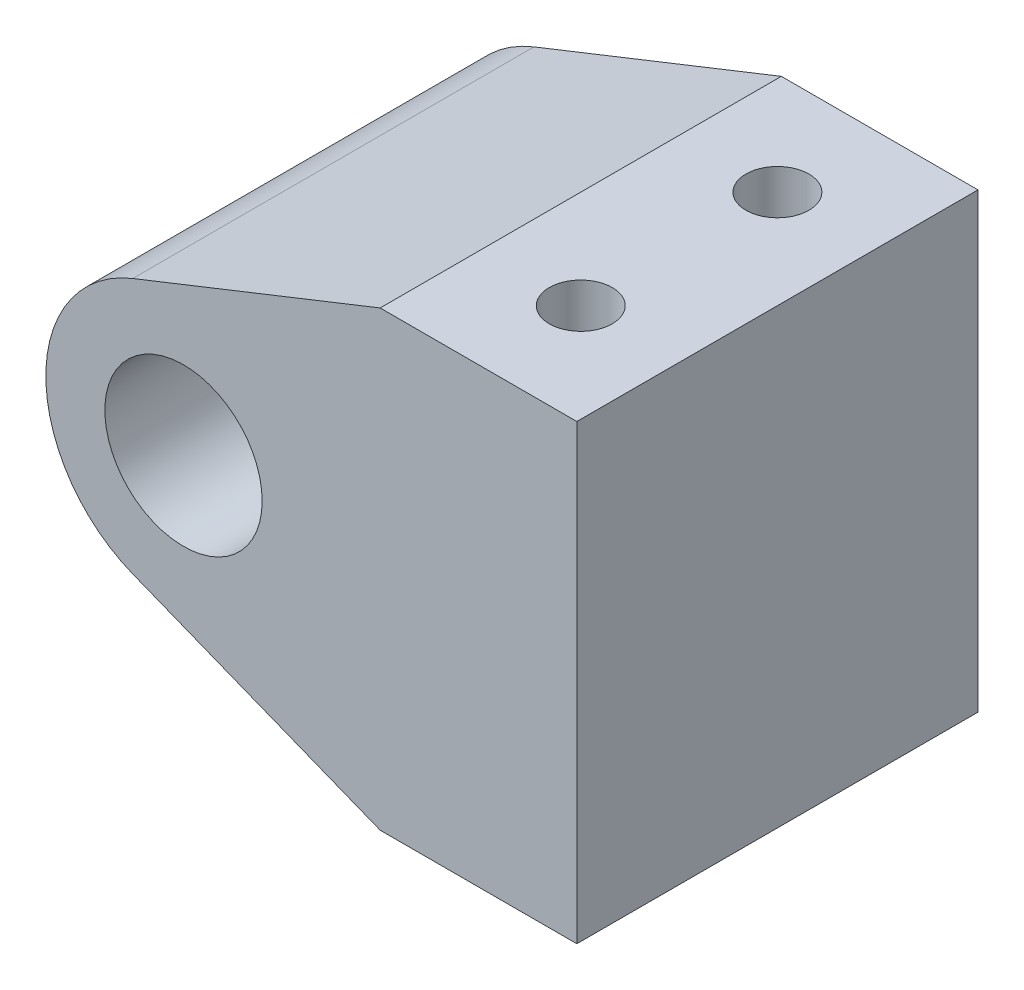
ISO-10303-21;
HEADER;
FILE_DESCRIPTION(('STEP AP214'),'2;1');
FILE_NAME('part.step','',(''),(''),'','','');
FILE_SCHEMA(('AUTOMOTIVE_DESIGN { 1 0 10303 214 1 1 1 1 }'));
ENDSEC;
DATA;
#1=APPLICATION_CONTEXT('core data for automotive mechanical design processes');
#2=APPLICATION_PROTOCOL_DEFINITION('international standard','automotive_design',2000,#1);
#3=PRODUCT_CONTEXT('',#1,'mechanical');
#4=PRODUCT('Part','Part','',(#3));
#5=PRODUCT_RELATED_PRODUCT_CATEGORY('part','',(#4));
#6=PRODUCT_DEFINITION_FORMATION('','',#4);
#7=PRODUCT_DEFINITION_CONTEXT('part definition',#1,'design');
#8=PRODUCT_DEFINITION('design','',#6,#7);
#9=PRODUCT_DEFINITION_SHAPE('','',#8);
#10=(LENGTH_UNIT() NAMED_UNIT(*) SI_UNIT(.MILLI.,.METRE.));
#11=(NAMED_UNIT(*) PLANE_ANGLE_UNIT() SI_UNIT($,.RADIAN.));
#12=(NAMED_UNIT(*) SI_UNIT($,.STERADIAN.) SOLID_ANGLE_UNIT());
#13=UNCERTAINTY_MEASURE_WITH_UNIT(LENGTH_MEASURE(1.E-05),#10,'distance_accuracy_value','');
#14=(GEOMETRIC_REPRESENTATION_CONTEXT(3) GLOBAL_UNCERTAINTY_ASSIGNED_CONTEXT((#13)) GLOBAL_UNIT_ASSIGNED_CONTEXT((#10,
#11,#12)) REPRESENTATION_CONTEXT('',''));
#15=CARTESIAN_POINT('',(0.,0.,0.));
#16=DIRECTION('',(0.,0.,1.));
#17=DIRECTION('',(1.,0.,0.));
#18=AXIS2_PLACEMENT_3D('',#15,#16,#17);
#19=CARTESIAN_POINT('',(-20.,11.5,-20.4));
#20=DIRECTION('',(0.,0.,-1.));
#21=DIRECTION('',(1.,0.,0.));
#22=AXIS2_PLACEMENT_3D('',#19,#20,#21);
#23=PLANE('',#22);
#24=DIRECTION('',(0.,1.,0.));
#25=VECTOR('',#24,1.);
#26=CARTESIAN_POINT('',(0.,0.,-20.4));
#27=LINE('',#26,#25);
#28=CARTESIAN_POINT('',(0.,0.,-20.4));
#29=VERTEX_POINT('',#28);
#30=CARTESIAN_POINT('',(0.,23.,-20.4));
#31=VERTEX_POINT('',#30);
#32=EDGE_CURVE('E143',#29,#31,#27,.T.);
#33=ORIENTED_EDGE('',*,*,#32,.F.);
#34=DIRECTION('',(1.,0.,0.));
#35=VECTOR('',#34,1.);
#36=CARTESIAN_POINT('',(0.,0.,-20.4));
#37=LINE('',#36,#35);
#38=CARTESIAN_POINT('',(-10.,0.,-20.4));
#39=VERTEX_POINT('',#38);
#40=EDGE_CURVE('E123',#39,#29,#37,.T.);
#41=ORIENTED_EDGE('',*,*,#40,.F.);
#42=DIRECTION('',(0.929471964291965,-0.36889275893576,0.));
#43=VECTOR('',#42,1.);
#44=CARTESIAN_POINT('',(-22.5822493125503,4.99369624995625,-20.4));
#45=LINE('',#44,#43);
#46=CARTESIAN_POINT('',(-22.5822493125503,4.99369624995625,-20.4));
#47=VERTEX_POINT('',#46);
#48=EDGE_CURVE('E104',#47,#39,#45,.T.);
#49=ORIENTED_EDGE('',*,*,#48,.F.);
#50=CARTESIAN_POINT('',(-20.,11.5,-20.4));
#51=DIRECTION('',(0.,0.,1.));
#52=DIRECTION('',(1.,0.,0.));
#53=AXIS2_PLACEMENT_3D('',#50,#51,#52);
#54=CIRCLE('',#53,7.);
#55=CARTESIAN_POINT('',(-22.5822493125503,18.0063037500437,-20.4));
#56=VERTEX_POINT('',#55);
#57=EDGE_CURVE('E114',#56,#47,#54,.T.);
#58=ORIENTED_EDGE('',*,*,#57,.F.);
#59=DIRECTION('',(-0.929471964291965,-0.36889275893576,0.));
#60=VECTOR('',#59,1.);
#61=CARTESIAN_POINT('',(-22.5822493125503,18.0063037500437,-20.4));
#62=LINE('',#61,#60);
#63=CARTESIAN_POINT('',(-10.,23.,-20.4));
#64=VERTEX_POINT('',#63);
#65=EDGE_CURVE('E119',#64,#56,#62,.T.);
#66=ORIENTED_EDGE('',*,*,#65,.F.);
#67=DIRECTION('',(-1.,0.,0.));
#68=VECTOR('',#67,1.);
#69=CARTESIAN_POINT('',(0.,23.,-20.4));
#70=LINE('',#69,#68);
#71=EDGE_CURVE('E148',#31,#64,#70,.T.);
#72=ORIENTED_EDGE('',*,*,#71,.F.);
#73=EDGE_LOOP('',(#33,#41,#49,#58,#66,#72));
#74=FACE_BOUND('',#73,.T.);
#75=CARTESIAN_POINT('',(-20.,11.5,-20.4));
#76=DIRECTION('',(0.,0.,1.));
#77=DIRECTION('',(1.,0.,0.));
#78=AXIS2_PLACEMENT_3D('',#75,#76,#77);
#79=CIRCLE('',#78,4.);
#80=CARTESIAN_POINT('',(-16.,11.5,-20.4));
#81=VERTEX_POINT('',#80);
#82=EDGE_CURVE('E132',#81,#81,#79,.T.);
#83=ORIENTED_EDGE('',*,*,#82,.T.);
#84=EDGE_LOOP('',(#83));
#85=FACE_BOUND('',#84,.T.);
#86=ADVANCED_FACE('F43',(#74,#85),#23,.T.);
#87=CARTESIAN_POINT('',(-20.,11.5,0.));
#88=DIRECTION('',(0.,0.,-1.));
#89=DIRECTION('',(1.,0.,0.));
#90=AXIS2_PLACEMENT_3D('',#87,#88,#89);
#91=PLANE('',#90);
#92=DIRECTION('',(0.,1.,0.));
#93=VECTOR('',#92,1.);
#94=CARTESIAN_POINT('',(0.,0.,0.));
#95=LINE('',#94,#93);
#96=CARTESIAN_POINT('',(0.,0.,0.));
#97=VERTEX_POINT('',#96);
#98=CARTESIAN_POINT('',(0.,23.,0.));
#99=VERTEX_POINT('',#98);
#100=EDGE_CURVE('E128',#97,#99,#95,.T.);
#101=ORIENTED_EDGE('',*,*,#100,.T.);
#102=DIRECTION('',(-1.,0.,0.));
#103=VECTOR('',#102,1.);
#104=CARTESIAN_POINT('',(0.,23.,0.));
#105=LINE('',#104,#103);
#106=CARTESIAN_POINT('',(-10.,23.,0.));
#107=VERTEX_POINT('',#106);
#108=EDGE_CURVE('E131',#99,#107,#105,.T.);
#109=ORIENTED_EDGE('',*,*,#108,.T.);
#110=DIRECTION('',(-0.929471964291965,-0.36889275893576,0.));
#111=VECTOR('',#110,1.);
#112=CARTESIAN_POINT('',(-22.5822493125503,18.0063037500437,0.));
#113=LINE('',#112,#111);
#114=CARTESIAN_POINT('',(-22.5822493125503,18.0063037500437,0.));
#115=VERTEX_POINT('',#114);
#116=EDGE_CURVE('E135',#107,#115,#113,.T.);
#117=ORIENTED_EDGE('',*,*,#116,.T.);
#118=CARTESIAN_POINT('',(-20.,11.5,0.));
#119=DIRECTION('',(0.,0.,1.));
#120=DIRECTION('',(1.,0.,0.));
#121=AXIS2_PLACEMENT_3D('',#118,#119,#120);
#122=CIRCLE('',#121,7.);
#123=CARTESIAN_POINT('',(-22.5822493125503,4.99369624995625,0.));
#124=VERTEX_POINT('',#123);
#125=EDGE_CURVE('E138',#115,#124,#122,.T.);
#126=ORIENTED_EDGE('',*,*,#125,.T.);
#127=DIRECTION('',(0.929471964291965,-0.36889275893576,0.));
#128=VECTOR('',#127,1.);
#129=CARTESIAN_POINT('',(-22.5822493125503,4.99369624995625,0.));
#130=LINE('',#129,#128);
#131=CARTESIAN_POINT('',(-10.,0.,0.));
#132=VERTEX_POINT('',#131);
#133=EDGE_CURVE('E107',#124,#132,#130,.T.);
#134=ORIENTED_EDGE('',*,*,#133,.T.);
#135=DIRECTION('',(1.,0.,0.));
#136=VECTOR('',#135,1.);
#137=CARTESIAN_POINT('',(0.,0.,0.));
#138=LINE('',#137,#136);
#139=EDGE_CURVE('E141',#132,#97,#138,.T.);
#140=ORIENTED_EDGE('',*,*,#139,.T.);
#141=EDGE_LOOP('',(#101,#109,#117,#126,#134,#140));
#142=FACE_BOUND('',#141,.T.);
#143=CARTESIAN_POINT('',(-20.,11.5,0.));
#144=DIRECTION('',(0.,0.,1.));
#145=DIRECTION('',(1.,0.,0.));
#146=AXIS2_PLACEMENT_3D('',#143,#144,#145);
#147=CIRCLE('',#146,4.);
#148=CARTESIAN_POINT('',(-16.,11.5,0.));
#149=VERTEX_POINT('',#148);
#150=EDGE_CURVE('E157',#149,#149,#147,.T.);
#151=ORIENTED_EDGE('',*,*,#150,.F.);
#152=EDGE_LOOP('',(#151));
#153=FACE_BOUND('',#152,.T.);
#154=ADVANCED_FACE('F152',(#142,#153),#91,.F.);
#155=CARTESIAN_POINT('',(0.,0.,-20.4));
#156=DIRECTION('',(-1.,0.,0.));
#157=DIRECTION('',(0.,0.,-1.));
#158=AXIS2_PLACEMENT_3D('',#155,#156,#157);
#159=PLANE('',#158);
#160=ORIENTED_EDGE('',*,*,#100,.F.);
#161=DIRECTION('',(0.,0.,1.));
#162=VECTOR('',#161,1.);
#163=CARTESIAN_POINT('',(0.,0.,-20.4));
#164=LINE('',#163,#162);
#165=EDGE_CURVE('E60',#29,#97,#164,.T.);
#166=ORIENTED_EDGE('',*,*,#165,.F.);
#167=ORIENTED_EDGE('',*,*,#32,.T.);
#168=DIRECTION('',(0.,0.,1.));
#169=VECTOR('',#168,1.);
#170=CARTESIAN_POINT('',(0.,23.,-20.4));
#171=LINE('',#170,#169);
#172=EDGE_CURVE('E11',#31,#99,#171,.T.);
#173=ORIENTED_EDGE('',*,*,#172,.T.);
#174=EDGE_LOOP('',(#160,#166,#167,#173));
#175=FACE_BOUND('',#174,.T.);
#176=ADVANCED_FACE('F45',(#175),#159,.F.);
#177=CARTESIAN_POINT('',(0.,23.,-20.4));
#178=DIRECTION('',(0.,-1.,0.));
#179=DIRECTION('',(1.,0.,0.));
#180=AXIS2_PLACEMENT_3D('',#177,#178,#179);
#181=PLANE('',#180);
#182=CARTESIAN_POINT('',(-5.,23.,-5.2));
#183=DIRECTION('',(0.,-1.,0.));
#184=DIRECTION('',(-1.,0.,0.));
#185=AXIS2_PLACEMENT_3D('',#182,#183,#184);
#186=CIRCLE('',#185,1.6);
#187=CARTESIAN_POINT('',(-6.6,23.,-5.2));
#188=VERTEX_POINT('',#187);
#189=EDGE_CURVE('E169',#188,#188,#186,.T.);
#190=ORIENTED_EDGE('',*,*,#189,.T.);
#191=EDGE_LOOP('',(#190));
#192=FACE_BOUND('',#191,.T.);
#193=CARTESIAN_POINT('',(-5.,23.,-15.2));
#194=DIRECTION('',(0.,-1.,0.));
#195=DIRECTION('',(-1.,0.,0.));
#196=AXIS2_PLACEMENT_3D('',#193,#194,#195);
#197=CIRCLE('',#196,1.6);
#198=CARTESIAN_POINT('',(-6.6,23.,-15.2));
#199=VERTEX_POINT('',#198);
#200=EDGE_CURVE('E166',#199,#199,#197,.T.);
#201=ORIENTED_EDGE('',*,*,#200,.T.);
#202=EDGE_LOOP('',(#201));
#203=FACE_BOUND('',#202,.T.);
#204=ORIENTED_EDGE('',*,*,#108,.F.);
#205=ORIENTED_EDGE('',*,*,#172,.F.);
#206=ORIENTED_EDGE('',*,*,#71,.T.);
#207=DIRECTION('',(0.,0.,1.));
#208=VECTOR('',#207,1.);
#209=CARTESIAN_POINT('',(-10.,23.,-20.4));
#210=LINE('',#209,#208);
#211=EDGE_CURVE('E52',#64,#107,#210,.T.);
#212=ORIENTED_EDGE('',*,*,#211,.T.);
#213=EDGE_LOOP('',(#204,#205,#206,#212));
#214=FACE_BOUND('',#213,.T.);
#215=ADVANCED_FACE('F147',(#192,#203,#214),#181,.F.);
#216=CARTESIAN_POINT('',(-22.5822493125503,18.0063037500437,-20.4));
#217=DIRECTION('',(0.36889275893576,-0.929471964291965,0.));
#218=DIRECTION('',(0.929471964291965,0.36889275893576,0.));
#219=AXIS2_PLACEMENT_3D('',#216,#217,#218);
#220=PLANE('',#219);
#221=ORIENTED_EDGE('',*,*,#116,.F.);
#222=ORIENTED_EDGE('',*,*,#211,.F.);
#223=ORIENTED_EDGE('',*,*,#65,.T.);
#224=DIRECTION('',(0.,0.,1.));
#225=VECTOR('',#224,1.);
#226=CARTESIAN_POINT('',(-22.5822493125503,18.0063037500437,-20.4));
#227=LINE('',#226,#225);
#228=EDGE_CURVE('E111',#56,#115,#227,.T.);
#229=ORIENTED_EDGE('',*,*,#228,.T.);
#230=EDGE_LOOP('',(#221,#222,#223,#229));
#231=FACE_BOUND('',#230,.T.);
#232=ADVANCED_FACE('F150',(#231),#220,.F.);
#233=CARTESIAN_POINT('',(-20.,11.5,-20.4));
#234=DIRECTION('',(0.,0.,1.));
#235=DIRECTION('',(-1.,0.,0.));
#236=AXIS2_PLACEMENT_3D('',#233,#234,#235);
#237=CYLINDRICAL_SURFACE('',#236,7.);
#238=ORIENTED_EDGE('',*,*,#125,.F.);
#239=ORIENTED_EDGE('',*,*,#228,.F.);
#240=ORIENTED_EDGE('',*,*,#57,.T.);
#241=DIRECTION('',(0.,0.,1.));
#242=VECTOR('',#241,1.);
#243=CARTESIAN_POINT('',(-22.5822493125503,4.99369624995625,-20.4));
#244=LINE('',#243,#242);
#245=EDGE_CURVE('E100',#47,#124,#244,.T.);
#246=ORIENTED_EDGE('',*,*,#245,.T.);
#247=EDGE_LOOP('',(#238,#239,#240,#246));
#248=FACE_BOUND('',#247,.T.);
#249=ADVANCED_FACE('F115',(#248),#237,.T.);
#250=CARTESIAN_POINT('',(-22.5822493125503,4.99369624995625,-20.4));
#251=DIRECTION('',(0.36889275893576,0.929471964291965,0.));
#252=DIRECTION('',(-0.929471964291965,0.36889275893576,0.));
#253=AXIS2_PLACEMENT_3D('',#250,#251,#252);
#254=PLANE('',#253);
#255=ORIENTED_EDGE('',*,*,#133,.F.);
#256=ORIENTED_EDGE('',*,*,#245,.F.);
#257=ORIENTED_EDGE('',*,*,#48,.T.);
#258=DIRECTION('',(0.,0.,1.));
#259=VECTOR('',#258,1.);
#260=CARTESIAN_POINT('',(-10.,0.,-20.4));
#261=LINE('',#260,#259);
#262=EDGE_CURVE('E82',#39,#132,#261,.T.);
#263=ORIENTED_EDGE('',*,*,#262,.T.);
#264=EDGE_LOOP('',(#255,#256,#257,#263));
#265=FACE_BOUND('',#264,.T.);
#266=ADVANCED_FACE('F102',(#265),#254,.F.);
#267=CARTESIAN_POINT('',(0.,0.,-20.4));
#268=DIRECTION('',(0.,1.,0.));
#269=DIRECTION('',(-1.,0.,0.));
#270=AXIS2_PLACEMENT_3D('',#267,#268,#269);
#271=PLANE('',#270);
#272=CARTESIAN_POINT('',(-4.99999999999999,0.,-5.2));
#273=DIRECTION('',(0.,-1.,0.));
#274=DIRECTION('',(-1.,0.,0.));
#275=AXIS2_PLACEMENT_3D('',#272,#273,#274);
#276=CIRCLE('',#275,1.6);
#277=CARTESIAN_POINT('',(-6.59999999999999,0.,-5.2));
#278=VERTEX_POINT('',#277);
#279=EDGE_CURVE('E160',#278,#278,#276,.T.);
#280=ORIENTED_EDGE('',*,*,#279,.F.);
#281=EDGE_LOOP('',(#280));
#282=FACE_BOUND('',#281,.T.);
#283=CARTESIAN_POINT('',(-4.99999999999999,0.,-15.2));
#284=DIRECTION('',(0.,-1.,0.));
#285=DIRECTION('',(-1.,0.,0.));
#286=AXIS2_PLACEMENT_3D('',#283,#284,#285);
#287=CIRCLE('',#286,1.6);
#288=CARTESIAN_POINT('',(-6.59999999999999,0.,-15.2));
#289=VERTEX_POINT('',#288);
#290=EDGE_CURVE('E163',#289,#289,#287,.T.);
#291=ORIENTED_EDGE('',*,*,#290,.F.);
#292=EDGE_LOOP('',(#291));
#293=FACE_BOUND('',#292,.T.);
#294=ORIENTED_EDGE('',*,*,#139,.F.);
#295=ORIENTED_EDGE('',*,*,#262,.F.);
#296=ORIENTED_EDGE('',*,*,#40,.T.);
#297=ORIENTED_EDGE('',*,*,#165,.T.);
#298=EDGE_LOOP('',(#294,#295,#296,#297));
#299=FACE_BOUND('',#298,.T.);
#300=ADVANCED_FACE('F178',(#282,#293,#299),#271,.F.);
#301=CARTESIAN_POINT('',(-20.,11.5,-20.4));
#302=DIRECTION('',(0.,0.,1.));
#303=DIRECTION('',(-1.,0.,0.));
#304=AXIS2_PLACEMENT_3D('',#301,#302,#303);
#305=CYLINDRICAL_SURFACE('',#304,4.);
#306=ORIENTED_EDGE('',*,*,#82,.F.);
#307=EDGE_LOOP('',(#306));
#308=FACE_BOUND('',#307,.T.);
#309=ORIENTED_EDGE('',*,*,#150,.T.);
#310=EDGE_LOOP('',(#309));
#311=FACE_BOUND('',#310,.T.);
#312=ADVANCED_FACE('F181',(#308,#311),#305,.F.);
#313=CARTESIAN_POINT('',(-4.99999999999999,0.,-15.2));
#314=DIRECTION('',(0.,1.,0.));
#315=DIRECTION('',(-1.,0.,0.));
#316=AXIS2_PLACEMENT_3D('',#313,#314,#315);
#317=CYLINDRICAL_SURFACE('',#316,1.6);
#318=ORIENTED_EDGE('',*,*,#290,.T.);
#319=EDGE_LOOP('',(#318));
#320=FACE_BOUND('',#319,.T.);
#321=ORIENTED_EDGE('',*,*,#200,.F.);
#322=EDGE_LOOP('',(#321));
#323=FACE_BOUND('',#322,.T.);
#324=ADVANCED_FACE('F185',(#320,#323),#317,.F.);
#325=CARTESIAN_POINT('',(-4.99999999999999,0.,-5.2));
#326=DIRECTION('',(0.,1.,0.));
#327=DIRECTION('',(-1.,0.,0.));
#328=AXIS2_PLACEMENT_3D('',#325,#326,#327);
#329=CYLINDRICAL_SURFACE('',#328,1.6);
#330=ORIENTED_EDGE('',*,*,#279,.T.);
#331=EDGE_LOOP('',(#330));
#332=FACE_BOUND('',#331,.T.);
#333=ORIENTED_EDGE('',*,*,#189,.F.);
#334=EDGE_LOOP('',(#333));
#335=FACE_BOUND('',#334,.T.);
#336=ADVANCED_FACE('F175',(#332,#335),#329,.F.);
#337=CLOSED_SHELL('',(#86,#154,#176,#215,#232,#249,#266,#300,#312,#324,#336));
#338=MANIFOLD_SOLID_BREP('B2',#337);
#339=ADVANCED_BREP_SHAPE_REPRESENTATION('',(#18,#338),#14);
#340=SHAPE_DEFINITION_REPRESENTATION(#9,#339);
ENDSEC;
END-ISO-10303-21;
